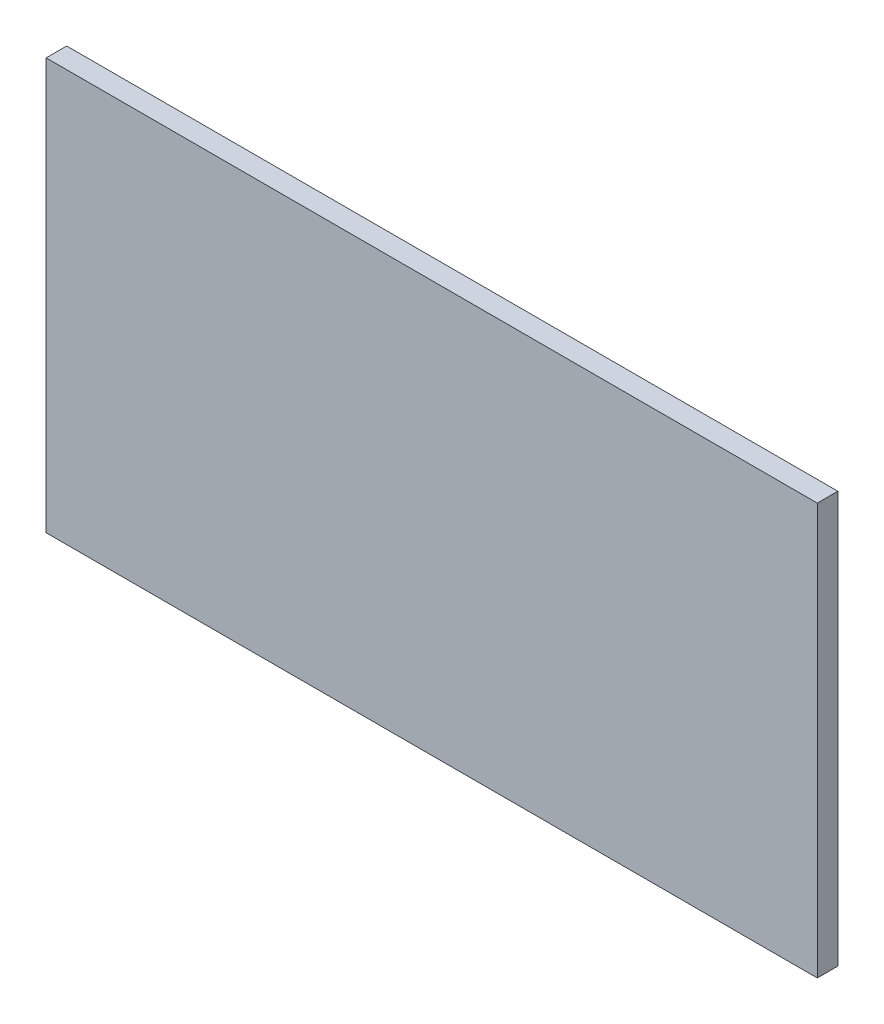
ISO-10303-21;
HEADER;
FILE_DESCRIPTION(('STEP AP214'),'2;1');
FILE_NAME('part.step','',(''),(''),'','','');
FILE_SCHEMA(('AUTOMOTIVE_DESIGN { 1 0 10303 214 1 1 1 1 }'));
ENDSEC;
DATA;
#1=APPLICATION_CONTEXT('core data for automotive mechanical design processes');
#2=APPLICATION_PROTOCOL_DEFINITION('international standard','automotive_design',2000,#1);
#3=PRODUCT_CONTEXT('',#1,'mechanical');
#4=PRODUCT('Part','Part','',(#3));
#5=PRODUCT_RELATED_PRODUCT_CATEGORY('part','',(#4));
#6=PRODUCT_DEFINITION_FORMATION('','',#4);
#7=PRODUCT_DEFINITION_CONTEXT('part definition',#1,'design');
#8=PRODUCT_DEFINITION('design','',#6,#7);
#9=PRODUCT_DEFINITION_SHAPE('','',#8);
#10=(LENGTH_UNIT() NAMED_UNIT(*) SI_UNIT(.MILLI.,.METRE.));
#11=(NAMED_UNIT(*) PLANE_ANGLE_UNIT() SI_UNIT($,.RADIAN.));
#12=(NAMED_UNIT(*) SI_UNIT($,.STERADIAN.) SOLID_ANGLE_UNIT());
#13=UNCERTAINTY_MEASURE_WITH_UNIT(LENGTH_MEASURE(1.E-05),#10,'distance_accuracy_value','');
#14=(GEOMETRIC_REPRESENTATION_CONTEXT(3) GLOBAL_UNCERTAINTY_ASSIGNED_CONTEXT((#13)) GLOBAL_UNIT_ASSIGNED_CONTEXT((#10,
#11,#12)) REPRESENTATION_CONTEXT('',''));
#15=CARTESIAN_POINT('',(0.,0.,0.));
#16=DIRECTION('',(0.,0.,1.));
#17=DIRECTION('',(1.,0.,0.));
#18=AXIS2_PLACEMENT_3D('',#15,#16,#17);
#19=CARTESIAN_POINT('',(75.,-40.,-2.));
#20=DIRECTION('',(0.,0.,1.));
#21=DIRECTION('',(1.,0.,0.));
#22=AXIS2_PLACEMENT_3D('',#19,#20,#21);
#23=PLANE('',#22);
#24=DIRECTION('',(0.,1.,0.));
#25=VECTOR('',#24,1.);
#26=CARTESIAN_POINT('',(-75.,-40.,-2.));
#27=LINE('',#26,#25);
#28=CARTESIAN_POINT('',(-75.,-40.,-2.));
#29=VERTEX_POINT('',#28);
#30=CARTESIAN_POINT('',(-75.,40.,-2.));
#31=VERTEX_POINT('',#30);
#32=EDGE_CURVE('E101',#29,#31,#27,.T.);
#33=ORIENTED_EDGE('',*,*,#32,.T.);
#34=DIRECTION('',(-1.,0.,0.));
#35=VECTOR('',#34,1.);
#36=CARTESIAN_POINT('',(75.,40.,-2.));
#37=LINE('',#36,#35);
#38=CARTESIAN_POINT('',(75.,40.,-2.));
#39=VERTEX_POINT('',#38);
#40=EDGE_CURVE('E11',#39,#31,#37,.T.);
#41=ORIENTED_EDGE('',*,*,#40,.F.);
#42=DIRECTION('',(0.,1.,0.));
#43=VECTOR('',#42,1.);
#44=CARTESIAN_POINT('',(75.,-40.,-2.));
#45=LINE('',#44,#43);
#46=CARTESIAN_POINT('',(75.,-40.,-2.));
#47=VERTEX_POINT('',#46);
#48=EDGE_CURVE('E89',#47,#39,#45,.T.);
#49=ORIENTED_EDGE('',*,*,#48,.F.);
#50=DIRECTION('',(-1.,0.,0.));
#51=VECTOR('',#50,1.);
#52=CARTESIAN_POINT('',(75.,-40.,-2.));
#53=LINE('',#52,#51);
#54=EDGE_CURVE('E97',#47,#29,#53,.T.);
#55=ORIENTED_EDGE('',*,*,#54,.T.);
#56=EDGE_LOOP('',(#33,#41,#49,#55));
#57=FACE_BOUND('',#56,.T.);
#58=ADVANCED_FACE('F38',(#57),#23,.F.);
#59=CARTESIAN_POINT('',(75.,40.,2.));
#60=DIRECTION('',(0.,-1.,0.));
#61=DIRECTION('',(0.,0.,-1.));
#62=AXIS2_PLACEMENT_3D('',#59,#60,#61);
#63=PLANE('',#62);
#64=DIRECTION('',(0.,0.,1.));
#65=VECTOR('',#64,1.);
#66=CARTESIAN_POINT('',(-75.,40.,2.));
#67=LINE('',#66,#65);
#68=CARTESIAN_POINT('',(-75.,40.,2.));
#69=VERTEX_POINT('',#68);
#70=EDGE_CURVE('E93',#31,#69,#67,.T.);
#71=ORIENTED_EDGE('',*,*,#70,.T.);
#72=DIRECTION('',(-1.,0.,0.));
#73=VECTOR('',#72,1.);
#74=CARTESIAN_POINT('',(75.,40.,2.));
#75=LINE('',#74,#73);
#76=CARTESIAN_POINT('',(75.,40.,2.));
#77=VERTEX_POINT('',#76);
#78=EDGE_CURVE('E46',#77,#69,#75,.T.);
#79=ORIENTED_EDGE('',*,*,#78,.F.);
#80=DIRECTION('',(0.,0.,1.));
#81=VECTOR('',#80,1.);
#82=CARTESIAN_POINT('',(75.,40.,2.));
#83=LINE('',#82,#81);
#84=EDGE_CURVE('E84',#39,#77,#83,.T.);
#85=ORIENTED_EDGE('',*,*,#84,.F.);
#86=ORIENTED_EDGE('',*,*,#40,.T.);
#87=EDGE_LOOP('',(#71,#79,#85,#86));
#88=FACE_BOUND('',#87,.T.);
#89=ADVANCED_FACE('F92',(#88),#63,.F.);
#90=CARTESIAN_POINT('',(75.,-40.,2.));
#91=DIRECTION('',(0.,0.,-1.));
#92=DIRECTION('',(-1.,0.,0.));
#93=AXIS2_PLACEMENT_3D('',#90,#91,#92);
#94=PLANE('',#93);
#95=DIRECTION('',(0.,-1.,0.));
#96=VECTOR('',#95,1.);
#97=CARTESIAN_POINT('',(-75.,-40.,2.));
#98=LINE('',#97,#96);
#99=CARTESIAN_POINT('',(-75.,-40.,2.));
#100=VERTEX_POINT('',#99);
#101=EDGE_CURVE('E71',#69,#100,#98,.T.);
#102=ORIENTED_EDGE('',*,*,#101,.T.);
#103=DIRECTION('',(-1.,0.,0.));
#104=VECTOR('',#103,1.);
#105=CARTESIAN_POINT('',(75.,-40.,2.));
#106=LINE('',#105,#104);
#107=CARTESIAN_POINT('',(75.,-40.,2.));
#108=VERTEX_POINT('',#107);
#109=EDGE_CURVE('E94',#108,#100,#106,.T.);
#110=ORIENTED_EDGE('',*,*,#109,.F.);
#111=DIRECTION('',(0.,-1.,0.));
#112=VECTOR('',#111,1.);
#113=CARTESIAN_POINT('',(75.,-40.,2.));
#114=LINE('',#113,#112);
#115=EDGE_CURVE('E87',#77,#108,#114,.T.);
#116=ORIENTED_EDGE('',*,*,#115,.F.);
#117=ORIENTED_EDGE('',*,*,#78,.T.);
#118=EDGE_LOOP('',(#102,#110,#116,#117));
#119=FACE_BOUND('',#118,.T.);
#120=ADVANCED_FACE('F95',(#119),#94,.F.);
#121=CARTESIAN_POINT('',(75.,-40.,2.));
#122=DIRECTION('',(0.,1.,0.));
#123=DIRECTION('',(0.,0.,1.));
#124=AXIS2_PLACEMENT_3D('',#121,#122,#123);
#125=PLANE('',#124);
#126=DIRECTION('',(0.,0.,-1.));
#127=VECTOR('',#126,1.);
#128=CARTESIAN_POINT('',(-75.,-40.,2.));
#129=LINE('',#128,#127);
#130=EDGE_CURVE('E77',#100,#29,#129,.T.);
#131=ORIENTED_EDGE('',*,*,#130,.T.);
#132=ORIENTED_EDGE('',*,*,#54,.F.);
#133=DIRECTION('',(0.,0.,-1.));
#134=VECTOR('',#133,1.);
#135=CARTESIAN_POINT('',(75.,-40.,2.));
#136=LINE('',#135,#134);
#137=EDGE_CURVE('E54',#108,#47,#136,.T.);
#138=ORIENTED_EDGE('',*,*,#137,.F.);
#139=ORIENTED_EDGE('',*,*,#109,.T.);
#140=EDGE_LOOP('',(#131,#132,#138,#139));
#141=FACE_BOUND('',#140,.T.);
#142=ADVANCED_FACE('F110',(#141),#125,.F.);
#143=CARTESIAN_POINT('',(75.,0.,0.));
#144=DIRECTION('',(-1.,0.,0.));
#145=DIRECTION('',(0.,0.,1.));
#146=AXIS2_PLACEMENT_3D('',#143,#144,#145);
#147=PLANE('',#146);
#148=ORIENTED_EDGE('',*,*,#48,.T.);
#149=ORIENTED_EDGE('',*,*,#84,.T.);
#150=ORIENTED_EDGE('',*,*,#115,.T.);
#151=ORIENTED_EDGE('',*,*,#137,.T.);
#152=EDGE_LOOP('',(#148,#149,#150,#151));
#153=FACE_BOUND('',#152,.T.);
#154=ADVANCED_FACE('F85',(#153),#147,.F.);
#155=CARTESIAN_POINT('',(-75.,0.,0.));
#156=DIRECTION('',(-1.,0.,0.));
#157=DIRECTION('',(0.,0.,1.));
#158=AXIS2_PLACEMENT_3D('',#155,#156,#157);
#159=PLANE('',#158);
#160=ORIENTED_EDGE('',*,*,#32,.F.);
#161=ORIENTED_EDGE('',*,*,#130,.F.);
#162=ORIENTED_EDGE('',*,*,#101,.F.);
#163=ORIENTED_EDGE('',*,*,#70,.F.);
#164=EDGE_LOOP('',(#160,#161,#162,#163));
#165=FACE_BOUND('',#164,.T.);
#166=ADVANCED_FACE('F113',(#165),#159,.T.);
#167=CLOSED_SHELL('',(#58,#89,#120,#142,#154,#166));
#168=MANIFOLD_SOLID_BREP('B2',#167);
#169=ADVANCED_BREP_SHAPE_REPRESENTATION('',(#18,#168),#14);
#170=SHAPE_DEFINITION_REPRESENTATION(#9,#169);
ENDSEC;
END-ISO-10303-21;
